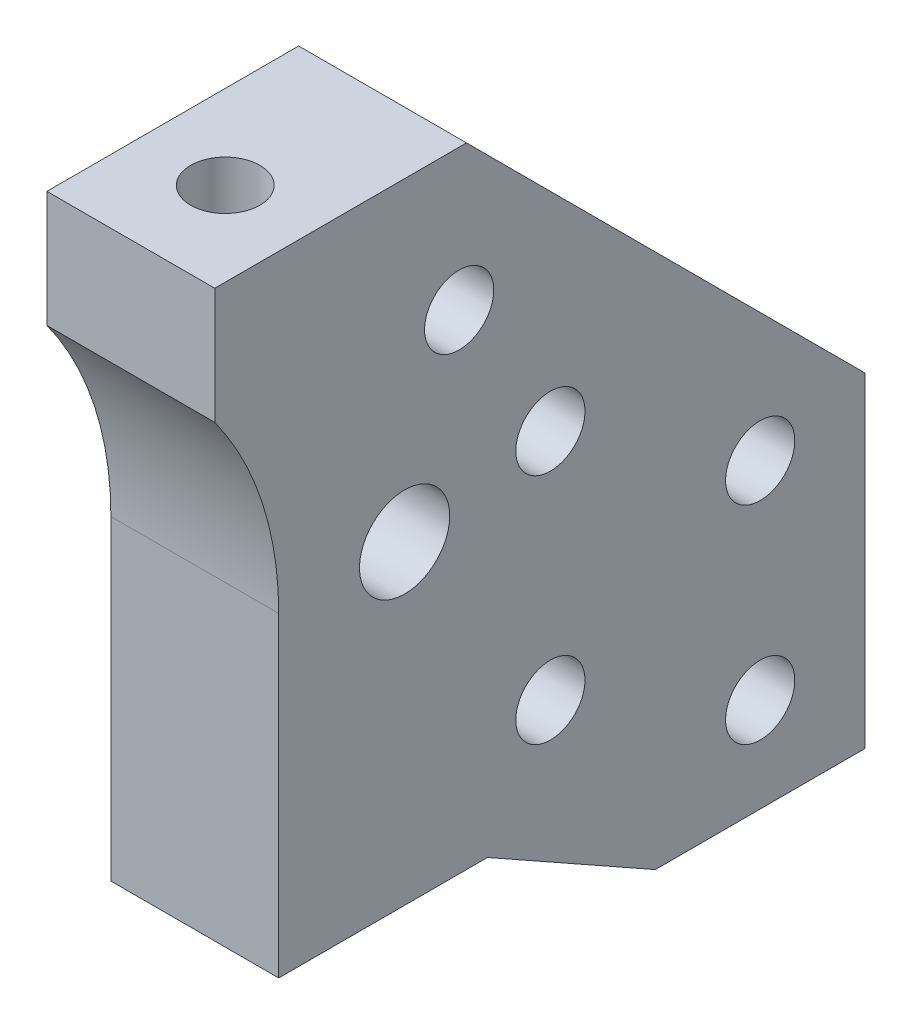
ISO-10303-21;
HEADER;
FILE_DESCRIPTION(('STEP AP214'),'2;1');
FILE_NAME('part.step','',(''),(''),'','','');
FILE_SCHEMA(('AUTOMOTIVE_DESIGN { 1 0 10303 214 1 1 1 1 }'));
ENDSEC;
DATA;
#1=APPLICATION_CONTEXT('core data for automotive mechanical design processes');
#2=APPLICATION_PROTOCOL_DEFINITION('international standard','automotive_design',2000,#1);
#3=PRODUCT_CONTEXT('',#1,'mechanical');
#4=PRODUCT('Part','Part','',(#3));
#5=PRODUCT_RELATED_PRODUCT_CATEGORY('part','',(#4));
#6=PRODUCT_DEFINITION_FORMATION('','',#4);
#7=PRODUCT_DEFINITION_CONTEXT('part definition',#1,'design');
#8=PRODUCT_DEFINITION('design','',#6,#7);
#9=PRODUCT_DEFINITION_SHAPE('','',#8);
#10=(LENGTH_UNIT() NAMED_UNIT(*) SI_UNIT(.MILLI.,.METRE.));
#11=(NAMED_UNIT(*) PLANE_ANGLE_UNIT() SI_UNIT($,.RADIAN.));
#12=(NAMED_UNIT(*) SI_UNIT($,.STERADIAN.) SOLID_ANGLE_UNIT());
#13=UNCERTAINTY_MEASURE_WITH_UNIT(LENGTH_MEASURE(1.E-05),#10,'distance_accuracy_value','');
#14=(GEOMETRIC_REPRESENTATION_CONTEXT(3) GLOBAL_UNCERTAINTY_ASSIGNED_CONTEXT((#13)) GLOBAL_UNIT_ASSIGNED_CONTEXT((#10,
#11,#12)) REPRESENTATION_CONTEXT('',''));
#15=CARTESIAN_POINT('',(0.,0.,0.));
#16=DIRECTION('',(0.,0.,1.));
#17=DIRECTION('',(1.,0.,0.));
#18=AXIS2_PLACEMENT_3D('',#15,#16,#17);
#19=CARTESIAN_POINT('',(-31.525,21.05,28.));
#20=DIRECTION('',(1.,0.,0.));
#21=DIRECTION('',(0.,0.,-1.));
#22=AXIS2_PLACEMENT_3D('',#19,#20,#21);
#23=CYLINDRICAL_SURFACE('',#22,16.05);
#24=CARTESIAN_POINT('',(-23.525,21.05,28.));
#25=DIRECTION('',(-1.,0.,0.));
#26=DIRECTION('',(0.,0.,1.));
#27=AXIS2_PLACEMENT_3D('',#24,#25,#26);
#28=CIRCLE('',#27,16.05);
#29=CARTESIAN_POINT('',(-23.525,30.462890098158,15.));
#30=VERTEX_POINT('',#29);
#31=CARTESIAN_POINT('',(-23.525,21.05,11.95));
#32=VERTEX_POINT('',#31);
#33=EDGE_CURVE('E158',#30,#32,#28,.T.);
#34=ORIENTED_EDGE('',*,*,#33,.F.);
#35=DIRECTION('',(1.,0.,0.));
#36=VECTOR('',#35,1.);
#37=CARTESIAN_POINT('',(-31.525,30.462890098158,15.));
#38=LINE('',#37,#36);
#39=CARTESIAN_POINT('',(-31.525,30.462890098158,15.));
#40=VERTEX_POINT('',#39);
#41=EDGE_CURVE('E11',#40,#30,#38,.T.);
#42=ORIENTED_EDGE('',*,*,#41,.F.);
#43=CARTESIAN_POINT('',(-31.525,21.05,28.));
#44=DIRECTION('',(-1.,0.,0.));
#45=DIRECTION('',(0.,0.,1.));
#46=AXIS2_PLACEMENT_3D('',#43,#44,#45);
#47=CIRCLE('',#46,16.05);
#48=CARTESIAN_POINT('',(-31.525,21.05,11.95));
#49=VERTEX_POINT('',#48);
#50=EDGE_CURVE('E182',#40,#49,#47,.T.);
#51=ORIENTED_EDGE('',*,*,#50,.T.);
#52=DIRECTION('',(1.,0.,0.));
#53=VECTOR('',#52,1.);
#54=CARTESIAN_POINT('',(-31.525,21.05,11.95));
#55=LINE('',#54,#53);
#56=EDGE_CURVE('E111',#49,#32,#55,.T.);
#57=ORIENTED_EDGE('',*,*,#56,.T.);
#58=EDGE_LOOP('',(#34,#42,#51,#57));
#59=FACE_BOUND('',#58,.T.);
#60=ADVANCED_FACE('F51',(#59),#23,.F.);
#61=CARTESIAN_POINT('',(-31.525,36.,15.));
#62=DIRECTION('',(0.,0.,1.));
#63=DIRECTION('',(0.,-1.,0.));
#64=AXIS2_PLACEMENT_3D('',#61,#62,#63);
#65=PLANE('',#64);
#66=DIRECTION('',(0.,-1.,0.));
#67=VECTOR('',#66,1.);
#68=CARTESIAN_POINT('',(-23.525,36.,15.));
#69=LINE('',#68,#67);
#70=CARTESIAN_POINT('',(-23.525,36.,15.));
#71=VERTEX_POINT('',#70);
#72=EDGE_CURVE('E180',#71,#30,#69,.T.);
#73=ORIENTED_EDGE('',*,*,#72,.F.);
#74=DIRECTION('',(1.,0.,0.));
#75=VECTOR('',#74,1.);
#76=CARTESIAN_POINT('',(-31.525,36.,15.));
#77=LINE('',#76,#75);
#78=CARTESIAN_POINT('',(-31.525,36.,15.));
#79=VERTEX_POINT('',#78);
#80=EDGE_CURVE('E60',#79,#71,#77,.T.);
#81=ORIENTED_EDGE('',*,*,#80,.F.);
#82=DIRECTION('',(0.,-1.,0.));
#83=VECTOR('',#82,1.);
#84=CARTESIAN_POINT('',(-31.525,36.,15.));
#85=LINE('',#84,#83);
#86=EDGE_CURVE('E148',#79,#40,#85,.T.);
#87=ORIENTED_EDGE('',*,*,#86,.T.);
#88=ORIENTED_EDGE('',*,*,#41,.T.);
#89=EDGE_LOOP('',(#73,#81,#87,#88));
#90=FACE_BOUND('',#89,.T.);
#91=ADVANCED_FACE('F256',(#90),#65,.T.);
#92=CARTESIAN_POINT('',(-31.525,36.,3.00000000000001));
#93=DIRECTION('',(0.,1.,0.));
#94=DIRECTION('',(0.,0.,1.));
#95=AXIS2_PLACEMENT_3D('',#92,#93,#94);
#96=PLANE('',#95);
#97=CARTESIAN_POINT('',(-27.525,36.,10.5));
#98=DIRECTION('',(0.,1.,0.));
#99=DIRECTION('',(0.,0.,1.));
#100=AXIS2_PLACEMENT_3D('',#97,#98,#99);
#101=CIRCLE('',#100,1.64999999999999);
#102=CARTESIAN_POINT('',(-27.525,36.,12.15));
#103=VERTEX_POINT('',#102);
#104=EDGE_CURVE('E345',#103,#103,#101,.T.);
#105=ORIENTED_EDGE('',*,*,#104,.F.);
#106=EDGE_LOOP('',(#105));
#107=FACE_BOUND('',#106,.T.);
#108=DIRECTION('',(0.,0.,1.));
#109=VECTOR('',#108,1.);
#110=CARTESIAN_POINT('',(-23.525,36.,3.00000000000001));
#111=LINE('',#110,#109);
#112=CARTESIAN_POINT('',(-23.525,36.,3.00000000000001));
#113=VERTEX_POINT('',#112);
#114=EDGE_CURVE('E135',#113,#71,#111,.T.);
#115=ORIENTED_EDGE('',*,*,#114,.F.);
#116=DIRECTION('',(1.,0.,0.));
#117=VECTOR('',#116,1.);
#118=CARTESIAN_POINT('',(-31.525,36.,3.00000000000001));
#119=LINE('',#118,#117);
#120=CARTESIAN_POINT('',(-31.525,36.,3.00000000000001));
#121=VERTEX_POINT('',#120);
#122=EDGE_CURVE('E130',#121,#113,#119,.T.);
#123=ORIENTED_EDGE('',*,*,#122,.F.);
#124=DIRECTION('',(0.,0.,1.));
#125=VECTOR('',#124,1.);
#126=CARTESIAN_POINT('',(-31.525,36.,3.00000000000001));
#127=LINE('',#126,#125);
#128=EDGE_CURVE('E133',#121,#79,#127,.T.);
#129=ORIENTED_EDGE('',*,*,#128,.T.);
#130=ORIENTED_EDGE('',*,*,#80,.T.);
#131=EDGE_LOOP('',(#115,#123,#129,#130));
#132=FACE_BOUND('',#131,.T.);
#133=ADVANCED_FACE('F132',(#107,#132),#96,.T.);
#134=CARTESIAN_POINT('',(-31.525,17.,-16.));
#135=DIRECTION('',(0.,0.707106781186549,-0.707106781186546));
#136=DIRECTION('',(0.,0.707106781186546,0.707106781186549));
#137=AXIS2_PLACEMENT_3D('',#134,#135,#136);
#138=PLANE('',#137);
#139=DIRECTION('',(0.,0.707106781186546,0.707106781186549));
#140=VECTOR('',#139,1.);
#141=CARTESIAN_POINT('',(-23.525,17.,-16.));
#142=LINE('',#141,#140);
#143=CARTESIAN_POINT('',(-23.525,17.,-16.));
#144=VERTEX_POINT('',#143);
#145=EDGE_CURVE('E177',#144,#113,#142,.T.);
#146=ORIENTED_EDGE('',*,*,#145,.F.);
#147=DIRECTION('',(1.,0.,0.));
#148=VECTOR('',#147,1.);
#149=CARTESIAN_POINT('',(-31.525,17.,-16.));
#150=LINE('',#149,#148);
#151=CARTESIAN_POINT('',(-31.525,17.,-16.));
#152=VERTEX_POINT('',#151);
#153=EDGE_CURVE('E140',#152,#144,#150,.T.);
#154=ORIENTED_EDGE('',*,*,#153,.F.);
#155=DIRECTION('',(0.,0.707106781186546,0.707106781186549));
#156=VECTOR('',#155,1.);
#157=CARTESIAN_POINT('',(-31.525,17.,-16.));
#158=LINE('',#157,#156);
#159=EDGE_CURVE('E146',#152,#121,#158,.T.);
#160=ORIENTED_EDGE('',*,*,#159,.T.);
#161=ORIENTED_EDGE('',*,*,#122,.T.);
#162=EDGE_LOOP('',(#146,#154,#160,#161));
#163=FACE_BOUND('',#162,.T.);
#164=ADVANCED_FACE('F150',(#163),#138,.T.);
#165=CARTESIAN_POINT('',(-31.525,1.5,-16.));
#166=DIRECTION('',(0.,0.,-1.));
#167=DIRECTION('',(-1.,0.,0.));
#168=AXIS2_PLACEMENT_3D('',#165,#166,#167);
#169=PLANE('',#168);
#170=DIRECTION('',(0.,1.,0.));
#171=VECTOR('',#170,1.);
#172=CARTESIAN_POINT('',(-23.525,1.5,-16.));
#173=LINE('',#172,#171);
#174=CARTESIAN_POINT('',(-23.525,1.5,-16.));
#175=VERTEX_POINT('',#174);
#176=EDGE_CURVE('E174',#175,#144,#173,.T.);
#177=ORIENTED_EDGE('',*,*,#176,.F.);
#178=DIRECTION('',(1.,0.,0.));
#179=VECTOR('',#178,1.);
#180=CARTESIAN_POINT('',(-31.525,1.5,-16.));
#181=LINE('',#180,#179);
#182=CARTESIAN_POINT('',(-31.525,1.5,-16.));
#183=VERTEX_POINT('',#182);
#184=EDGE_CURVE('E186',#183,#175,#181,.T.);
#185=ORIENTED_EDGE('',*,*,#184,.F.);
#186=DIRECTION('',(0.,1.,0.));
#187=VECTOR('',#186,1.);
#188=CARTESIAN_POINT('',(-31.525,1.5,-16.));
#189=LINE('',#188,#187);
#190=EDGE_CURVE('E151',#183,#152,#189,.T.);
#191=ORIENTED_EDGE('',*,*,#190,.T.);
#192=ORIENTED_EDGE('',*,*,#153,.T.);
#193=EDGE_LOOP('',(#177,#185,#191,#192));
#194=FACE_BOUND('',#193,.T.);
#195=ADVANCED_FACE('F272',(#194),#169,.T.);
#196=CARTESIAN_POINT('',(-31.525,1.5,-6.00000000000002));
#197=DIRECTION('',(0.,-1.,0.));
#198=DIRECTION('',(0.,0.,-1.));
#199=AXIS2_PLACEMENT_3D('',#196,#197,#198);
#200=PLANE('',#199);
#201=DIRECTION('',(0.,0.,-1.));
#202=VECTOR('',#201,1.);
#203=CARTESIAN_POINT('',(-23.525,1.5,-6.00000000000002));
#204=LINE('',#203,#202);
#205=CARTESIAN_POINT('',(-23.525,1.5,-6.00000000000002));
#206=VERTEX_POINT('',#205);
#207=EDGE_CURVE('E171',#206,#175,#204,.T.);
#208=ORIENTED_EDGE('',*,*,#207,.F.);
#209=DIRECTION('',(1.,0.,0.));
#210=VECTOR('',#209,1.);
#211=CARTESIAN_POINT('',(-31.525,1.5,-6.00000000000002));
#212=LINE('',#211,#210);
#213=CARTESIAN_POINT('',(-31.525,1.5,-6.00000000000002));
#214=VERTEX_POINT('',#213);
#215=EDGE_CURVE('E188',#214,#206,#212,.T.);
#216=ORIENTED_EDGE('',*,*,#215,.F.);
#217=DIRECTION('',(0.,0.,-1.));
#218=VECTOR('',#217,1.);
#219=CARTESIAN_POINT('',(-31.525,1.5,-6.00000000000002));
#220=LINE('',#219,#218);
#221=EDGE_CURVE('E153',#214,#183,#220,.T.);
#222=ORIENTED_EDGE('',*,*,#221,.T.);
#223=ORIENTED_EDGE('',*,*,#184,.T.);
#224=EDGE_LOOP('',(#208,#216,#222,#223));
#225=FACE_BOUND('',#224,.T.);
#226=ADVANCED_FACE('F243',(#225),#200,.T.);
#227=CARTESIAN_POINT('',(-31.525,5.99999999999999,1.99999999999998));
#228=DIRECTION('',(0.,-0.87157553712455,0.490261239632558));
#229=DIRECTION('',(0.,-0.490261239632558,-0.87157553712455));
#230=AXIS2_PLACEMENT_3D('',#227,#228,#229);
#231=PLANE('',#230);
#232=DIRECTION('',(0.,-0.490261239632558,-0.87157553712455));
#233=VECTOR('',#232,1.);
#234=CARTESIAN_POINT('',(-23.525,5.99999999999999,1.99999999999998));
#235=LINE('',#234,#233);
#236=CARTESIAN_POINT('',(-23.525,5.99999999999999,1.99999999999998));
#237=VERTEX_POINT('',#236);
#238=EDGE_CURVE('E168',#237,#206,#235,.T.);
#239=ORIENTED_EDGE('',*,*,#238,.F.);
#240=DIRECTION('',(1.,0.,0.));
#241=VECTOR('',#240,1.);
#242=CARTESIAN_POINT('',(-31.525,5.99999999999999,1.99999999999998));
#243=LINE('',#242,#241);
#244=CARTESIAN_POINT('',(-31.525,5.99999999999999,1.99999999999998));
#245=VERTEX_POINT('',#244);
#246=EDGE_CURVE('E190',#245,#237,#243,.T.);
#247=ORIENTED_EDGE('',*,*,#246,.F.);
#248=DIRECTION('',(0.,-0.490261239632558,-0.87157553712455));
#249=VECTOR('',#248,1.);
#250=CARTESIAN_POINT('',(-31.525,5.99999999999999,1.99999999999998));
#251=LINE('',#250,#249);
#252=EDGE_CURVE('E237',#245,#214,#251,.T.);
#253=ORIENTED_EDGE('',*,*,#252,.T.);
#254=ORIENTED_EDGE('',*,*,#215,.T.);
#255=EDGE_LOOP('',(#239,#247,#253,#254));
#256=FACE_BOUND('',#255,.T.);
#257=ADVANCED_FACE('F249',(#256),#231,.T.);
#258=CARTESIAN_POINT('',(-31.525,5.99999999999999,11.95));
#259=DIRECTION('',(0.,-1.,0.));
#260=DIRECTION('',(0.,0.,-1.));
#261=AXIS2_PLACEMENT_3D('',#258,#259,#260);
#262=PLANE('',#261);
#263=CARTESIAN_POINT('',(-27.525,5.99999999999999,6.98749999999999));
#264=DIRECTION('',(0.,-1.,0.));
#265=DIRECTION('',(0.,0.,-1.));
#266=AXIS2_PLACEMENT_3D('',#263,#264,#265);
#267=CIRCLE('',#266,1.64999999999999);
#268=CARTESIAN_POINT('',(-27.525,5.99999999999999,5.3375));
#269=VERTEX_POINT('',#268);
#270=EDGE_CURVE('E347',#269,#269,#267,.T.);
#271=ORIENTED_EDGE('',*,*,#270,.F.);
#272=EDGE_LOOP('',(#271));
#273=FACE_BOUND('',#272,.T.);
#274=DIRECTION('',(0.,0.,-1.));
#275=VECTOR('',#274,1.);
#276=CARTESIAN_POINT('',(-23.525,5.99999999999999,11.95));
#277=LINE('',#276,#275);
#278=CARTESIAN_POINT('',(-23.525,5.99999999999999,11.95));
#279=VERTEX_POINT('',#278);
#280=EDGE_CURVE('E165',#279,#237,#277,.T.);
#281=ORIENTED_EDGE('',*,*,#280,.F.);
#282=DIRECTION('',(1.,0.,0.));
#283=VECTOR('',#282,1.);
#284=CARTESIAN_POINT('',(-31.525,5.99999999999999,11.95));
#285=LINE('',#284,#283);
#286=CARTESIAN_POINT('',(-31.525,5.99999999999999,11.95));
#287=VERTEX_POINT('',#286);
#288=EDGE_CURVE('E192',#287,#279,#285,.T.);
#289=ORIENTED_EDGE('',*,*,#288,.F.);
#290=DIRECTION('',(0.,0.,-1.));
#291=VECTOR('',#290,1.);
#292=CARTESIAN_POINT('',(-31.525,5.99999999999999,11.95));
#293=LINE('',#292,#291);
#294=EDGE_CURVE('E234',#287,#245,#293,.T.);
#295=ORIENTED_EDGE('',*,*,#294,.T.);
#296=ORIENTED_EDGE('',*,*,#246,.T.);
#297=EDGE_LOOP('',(#281,#289,#295,#296));
#298=FACE_BOUND('',#297,.T.);
#299=ADVANCED_FACE('F252',(#273,#298),#262,.T.);
#300=CARTESIAN_POINT('',(-31.525,5.99999999999999,11.95));
#301=DIRECTION('',(0.,0.,1.));
#302=DIRECTION('',(0.,-1.,0.));
#303=AXIS2_PLACEMENT_3D('',#300,#301,#302);
#304=PLANE('',#303);
#305=DIRECTION('',(0.,-1.,0.));
#306=VECTOR('',#305,1.);
#307=CARTESIAN_POINT('',(-23.525,5.99999999999999,11.95));
#308=LINE('',#307,#306);
#309=EDGE_CURVE('E161',#32,#279,#308,.T.);
#310=ORIENTED_EDGE('',*,*,#309,.F.);
#311=ORIENTED_EDGE('',*,*,#56,.F.);
#312=DIRECTION('',(0.,-1.,0.));
#313=VECTOR('',#312,1.);
#314=CARTESIAN_POINT('',(-31.525,5.99999999999999,11.95));
#315=LINE('',#314,#313);
#316=EDGE_CURVE('E232',#49,#287,#315,.T.);
#317=ORIENTED_EDGE('',*,*,#316,.T.);
#318=ORIENTED_EDGE('',*,*,#288,.T.);
#319=EDGE_LOOP('',(#310,#311,#317,#318));
#320=FACE_BOUND('',#319,.T.);
#321=ADVANCED_FACE('F253',(#320),#304,.T.);
#322=CARTESIAN_POINT('',(-31.525,21.05,28.));
#323=DIRECTION('',(-1.,0.,0.));
#324=DIRECTION('',(0.,0.,1.));
#325=AXIS2_PLACEMENT_3D('',#322,#323,#324);
#326=PLANE('',#325);
#327=CARTESIAN_POINT('',(-31.525,29.2789321881345,3.34999999999999));
#328=DIRECTION('',(-1.,0.,0.));
#329=DIRECTION('',(0.,0.,1.));
#330=AXIS2_PLACEMENT_3D('',#327,#328,#329);
#331=CIRCLE('',#330,1.64999999999999);
#332=CARTESIAN_POINT('',(-31.525,29.2789321881345,4.99999999999998));
#333=VERTEX_POINT('',#332);
#334=EDGE_CURVE('E215',#333,#333,#331,.T.);
#335=ORIENTED_EDGE('',*,*,#334,.F.);
#336=EDGE_LOOP('',(#335));
#337=FACE_BOUND('',#336,.T.);
#338=CARTESIAN_POINT('',(-31.525,11.,-1.00000000000001));
#339=DIRECTION('',(-1.,0.,0.));
#340=DIRECTION('',(0.,0.,1.));
#341=AXIS2_PLACEMENT_3D('',#338,#339,#340);
#342=CIRCLE('',#341,1.64999999999999);
#343=CARTESIAN_POINT('',(-31.525,11.,0.649999999999973));
#344=VERTEX_POINT('',#343);
#345=EDGE_CURVE('E205',#344,#344,#342,.T.);
#346=ORIENTED_EDGE('',*,*,#345,.F.);
#347=EDGE_LOOP('',(#346));
#348=FACE_BOUND('',#347,.T.);
#349=CARTESIAN_POINT('',(-31.525,22.1005050633883,-1.00000000000001));
#350=DIRECTION('',(-1.,0.,0.));
#351=DIRECTION('',(0.,0.,1.));
#352=AXIS2_PLACEMENT_3D('',#349,#350,#351);
#353=CIRCLE('',#352,1.64999999999999);
#354=CARTESIAN_POINT('',(-31.525,22.1005050633883,0.649999999999975));
#355=VERTEX_POINT('',#354);
#356=EDGE_CURVE('E202',#355,#355,#353,.T.);
#357=ORIENTED_EDGE('',*,*,#356,.F.);
#358=EDGE_LOOP('',(#357));
#359=FACE_BOUND('',#358,.T.);
#360=CARTESIAN_POINT('',(-31.525,15.8859414427245,-11.));
#361=DIRECTION('',(-1.,0.,0.));
#362=DIRECTION('',(0.,0.,1.));
#363=AXIS2_PLACEMENT_3D('',#360,#361,#362);
#364=CIRCLE('',#363,1.64999999999999);
#365=CARTESIAN_POINT('',(-31.525,15.8859414427245,-9.35000000000003));
#366=VERTEX_POINT('',#365);
#367=EDGE_CURVE('E199',#366,#366,#364,.T.);
#368=ORIENTED_EDGE('',*,*,#367,.F.);
#369=EDGE_LOOP('',(#368));
#370=FACE_BOUND('',#369,.T.);
#371=CARTESIAN_POINT('',(-31.525,6.,-11.));
#372=DIRECTION('',(-1.,0.,0.));
#373=DIRECTION('',(0.,0.,1.));
#374=AXIS2_PLACEMENT_3D('',#371,#372,#373);
#375=CIRCLE('',#374,1.64999999999999);
#376=CARTESIAN_POINT('',(-31.525,6.,-9.35000000000003));
#377=VERTEX_POINT('',#376);
#378=EDGE_CURVE('E198',#377,#377,#375,.T.);
#379=ORIENTED_EDGE('',*,*,#378,.F.);
#380=EDGE_LOOP('',(#379));
#381=FACE_BOUND('',#380,.T.);
#382=CARTESIAN_POINT('',(-31.525,21.,5.94999999999998));
#383=DIRECTION('',(1.,0.,0.));
#384=DIRECTION('',(0.,0.,-1.));
#385=AXIS2_PLACEMENT_3D('',#382,#383,#384);
#386=CIRCLE('',#385,2.15);
#387=CARTESIAN_POINT('',(-31.525,21.,3.79999999999999));
#388=VERTEX_POINT('',#387);
#389=EDGE_CURVE('E162',#388,#388,#386,.T.);
#390=ORIENTED_EDGE('',*,*,#389,.T.);
#391=EDGE_LOOP('',(#390));
#392=FACE_BOUND('',#391,.T.);
#393=ORIENTED_EDGE('',*,*,#50,.F.);
#394=ORIENTED_EDGE('',*,*,#86,.F.);
#395=ORIENTED_EDGE('',*,*,#128,.F.);
#396=ORIENTED_EDGE('',*,*,#159,.F.);
#397=ORIENTED_EDGE('',*,*,#190,.F.);
#398=ORIENTED_EDGE('',*,*,#221,.F.);
#399=ORIENTED_EDGE('',*,*,#252,.F.);
#400=ORIENTED_EDGE('',*,*,#294,.F.);
#401=ORIENTED_EDGE('',*,*,#316,.F.);
#402=EDGE_LOOP('',(#393,#394,#395,#396,#397,#398,#399,#400,#401));
#403=FACE_BOUND('',#402,.T.);
#404=ADVANCED_FACE('F144',(#337,#348,#359,#370,#381,#392,#403),#326,.T.);
#405=CARTESIAN_POINT('',(-23.525,21.05,28.));
#406=DIRECTION('',(-1.,0.,0.));
#407=DIRECTION('',(0.,0.,1.));
#408=AXIS2_PLACEMENT_3D('',#405,#406,#407);
#409=PLANE('',#408);
#410=CARTESIAN_POINT('',(-23.525,29.2789321881345,3.34999999999999));
#411=DIRECTION('',(-1.,0.,0.));
#412=DIRECTION('',(0.,0.,1.));
#413=AXIS2_PLACEMENT_3D('',#410,#411,#412);
#414=CIRCLE('',#413,1.64999999999999);
#415=CARTESIAN_POINT('',(-23.525,29.2789321881345,4.99999999999998));
#416=VERTEX_POINT('',#415);
#417=EDGE_CURVE('E54',#416,#416,#414,.T.);
#418=ORIENTED_EDGE('',*,*,#417,.T.);
#419=EDGE_LOOP('',(#418));
#420=FACE_BOUND('',#419,.T.);
#421=CARTESIAN_POINT('',(-23.525,11.,-1.00000000000001));
#422=DIRECTION('',(-1.,0.,0.));
#423=DIRECTION('',(0.,0.,1.));
#424=AXIS2_PLACEMENT_3D('',#421,#422,#423);
#425=CIRCLE('',#424,1.64999999999999);
#426=CARTESIAN_POINT('',(-23.525,11.,0.649999999999975));
#427=VERTEX_POINT('',#426);
#428=EDGE_CURVE('E203',#427,#427,#425,.T.);
#429=ORIENTED_EDGE('',*,*,#428,.T.);
#430=EDGE_LOOP('',(#429));
#431=FACE_BOUND('',#430,.T.);
#432=CARTESIAN_POINT('',(-23.525,22.1005050633883,-1.00000000000001));
#433=DIRECTION('',(-1.,0.,0.));
#434=DIRECTION('',(0.,0.,1.));
#435=AXIS2_PLACEMENT_3D('',#432,#433,#434);
#436=CIRCLE('',#435,1.64999999999999);
#437=CARTESIAN_POINT('',(-23.525,22.1005050633883,0.649999999999977));
#438=VERTEX_POINT('',#437);
#439=EDGE_CURVE('E200',#438,#438,#436,.T.);
#440=ORIENTED_EDGE('',*,*,#439,.T.);
#441=EDGE_LOOP('',(#440));
#442=FACE_BOUND('',#441,.T.);
#443=CARTESIAN_POINT('',(-23.525,15.8859414427245,-11.));
#444=DIRECTION('',(-1.,0.,0.));
#445=DIRECTION('',(0.,0.,1.));
#446=AXIS2_PLACEMENT_3D('',#443,#444,#445);
#447=CIRCLE('',#446,1.64999999999999);
#448=CARTESIAN_POINT('',(-23.525,15.8859414427245,-9.35000000000003));
#449=VERTEX_POINT('',#448);
#450=EDGE_CURVE('E195',#449,#449,#447,.T.);
#451=ORIENTED_EDGE('',*,*,#450,.T.);
#452=EDGE_LOOP('',(#451));
#453=FACE_BOUND('',#452,.T.);
#454=CARTESIAN_POINT('',(-23.525,6.,-11.));
#455=DIRECTION('',(-1.,0.,0.));
#456=DIRECTION('',(0.,0.,1.));
#457=AXIS2_PLACEMENT_3D('',#454,#455,#456);
#458=CIRCLE('',#457,1.64999999999999);
#459=CARTESIAN_POINT('',(-23.525,6.,-9.35000000000003));
#460=VERTEX_POINT('',#459);
#461=EDGE_CURVE('E223',#460,#460,#458,.T.);
#462=ORIENTED_EDGE('',*,*,#461,.T.);
#463=EDGE_LOOP('',(#462));
#464=FACE_BOUND('',#463,.T.);
#465=CARTESIAN_POINT('',(-23.525,21.,5.94999999999998));
#466=DIRECTION('',(1.,0.,0.));
#467=DIRECTION('',(0.,0.,-1.));
#468=AXIS2_PLACEMENT_3D('',#465,#466,#467);
#469=CIRCLE('',#468,2.15);
#470=CARTESIAN_POINT('',(-23.525,21.,3.79999999999999));
#471=VERTEX_POINT('',#470);
#472=EDGE_CURVE('E226',#471,#471,#469,.T.);
#473=ORIENTED_EDGE('',*,*,#472,.F.);
#474=EDGE_LOOP('',(#473));
#475=FACE_BOUND('',#474,.T.);
#476=ORIENTED_EDGE('',*,*,#33,.T.);
#477=ORIENTED_EDGE('',*,*,#309,.T.);
#478=ORIENTED_EDGE('',*,*,#280,.T.);
#479=ORIENTED_EDGE('',*,*,#238,.T.);
#480=ORIENTED_EDGE('',*,*,#207,.T.);
#481=ORIENTED_EDGE('',*,*,#176,.T.);
#482=ORIENTED_EDGE('',*,*,#145,.T.);
#483=ORIENTED_EDGE('',*,*,#114,.T.);
#484=ORIENTED_EDGE('',*,*,#72,.T.);
#485=EDGE_LOOP('',(#476,#477,#478,#479,#480,#481,#482,#483,#484));
#486=FACE_BOUND('',#485,.T.);
#487=ADVANCED_FACE('F255',(#420,#431,#442,#453,#464,#475,#486),#409,.F.);
#488=CARTESIAN_POINT('',(-31.525,21.,5.94999999999998));
#489=DIRECTION('',(1.,0.,0.));
#490=DIRECTION('',(0.,0.,-1.));
#491=AXIS2_PLACEMENT_3D('',#488,#489,#490);
#492=CYLINDRICAL_SURFACE('',#491,2.15);
#493=ORIENTED_EDGE('',*,*,#389,.F.);
#494=EDGE_LOOP('',(#493));
#495=FACE_BOUND('',#494,.T.);
#496=ORIENTED_EDGE('',*,*,#472,.T.);
#497=EDGE_LOOP('',(#496));
#498=FACE_BOUND('',#497,.T.);
#499=ADVANCED_FACE('F295',(#495,#498),#492,.F.);
#500=CARTESIAN_POINT('',(-31.525,6.,-11.));
#501=DIRECTION('',(-1.,0.,0.));
#502=DIRECTION('',(0.,0.,1.));
#503=AXIS2_PLACEMENT_3D('',#500,#501,#502);
#504=CYLINDRICAL_SURFACE('',#503,1.64999999999999);
#505=ORIENTED_EDGE('',*,*,#378,.T.);
#506=EDGE_LOOP('',(#505));
#507=FACE_BOUND('',#506,.T.);
#508=ORIENTED_EDGE('',*,*,#461,.F.);
#509=EDGE_LOOP('',(#508));
#510=FACE_BOUND('',#509,.T.);
#511=ADVANCED_FACE('F302',(#507,#510),#504,.F.);
#512=CARTESIAN_POINT('',(-31.525,15.8859414427245,-11.));
#513=DIRECTION('',(-1.,0.,0.));
#514=DIRECTION('',(0.,0.,1.));
#515=AXIS2_PLACEMENT_3D('',#512,#513,#514);
#516=CYLINDRICAL_SURFACE('',#515,1.64999999999999);
#517=ORIENTED_EDGE('',*,*,#367,.T.);
#518=EDGE_LOOP('',(#517));
#519=FACE_BOUND('',#518,.T.);
#520=ORIENTED_EDGE('',*,*,#450,.F.);
#521=EDGE_LOOP('',(#520));
#522=FACE_BOUND('',#521,.T.);
#523=ADVANCED_FACE('F306',(#519,#522),#516,.F.);
#524=CARTESIAN_POINT('',(-31.525,22.1005050633883,-1.00000000000001));
#525=DIRECTION('',(-1.,0.,0.));
#526=DIRECTION('',(0.,0.,1.));
#527=AXIS2_PLACEMENT_3D('',#524,#525,#526);
#528=CYLINDRICAL_SURFACE('',#527,1.64999999999999);
#529=ORIENTED_EDGE('',*,*,#356,.T.);
#530=EDGE_LOOP('',(#529));
#531=FACE_BOUND('',#530,.T.);
#532=ORIENTED_EDGE('',*,*,#439,.F.);
#533=EDGE_LOOP('',(#532));
#534=FACE_BOUND('',#533,.T.);
#535=ADVANCED_FACE('F310',(#531,#534),#528,.F.);
#536=CARTESIAN_POINT('',(-31.525,11.,-1.00000000000001));
#537=DIRECTION('',(-1.,0.,0.));
#538=DIRECTION('',(0.,0.,1.));
#539=AXIS2_PLACEMENT_3D('',#536,#537,#538);
#540=CYLINDRICAL_SURFACE('',#539,1.64999999999999);
#541=ORIENTED_EDGE('',*,*,#345,.T.);
#542=EDGE_LOOP('',(#541));
#543=FACE_BOUND('',#542,.T.);
#544=ORIENTED_EDGE('',*,*,#428,.F.);
#545=EDGE_LOOP('',(#544));
#546=FACE_BOUND('',#545,.T.);
#547=ADVANCED_FACE('F314',(#543,#546),#540,.F.);
#548=CARTESIAN_POINT('',(-31.525,29.2789321881345,3.34999999999999));
#549=DIRECTION('',(-1.,0.,0.));
#550=DIRECTION('',(0.,0.,1.));
#551=AXIS2_PLACEMENT_3D('',#548,#549,#550);
#552=CYLINDRICAL_SURFACE('',#551,1.64999999999999);
#553=ORIENTED_EDGE('',*,*,#334,.T.);
#554=EDGE_LOOP('',(#553));
#555=FACE_BOUND('',#554,.T.);
#556=ORIENTED_EDGE('',*,*,#417,.F.);
#557=EDGE_LOOP('',(#556));
#558=FACE_BOUND('',#557,.T.);
#559=ADVANCED_FACE('F318',(#555,#558),#552,.F.);
#560=CARTESIAN_POINT('',(-27.525,17.5,6.98749999999999));
#561=DIRECTION('',(0.,-1.,0.));
#562=DIRECTION('',(0.,0.,-1.));
#563=AXIS2_PLACEMENT_3D('',#560,#561,#562);
#564=CONICAL_SURFACE('',#563,1.65,1.02974425867665);
#565=CARTESIAN_POINT('',(-27.525,18.4914200213955,6.98749999999999));
#566=VERTEX_POINT('',#565);
#567=VERTEX_LOOP('',#566);
#568=FACE_BOUND('',#567,.T.);
#569=CARTESIAN_POINT('',(-27.525,17.5,6.98749999999999));
#570=DIRECTION('',(0.,-1.,0.));
#571=DIRECTION('',(0.,0.,-1.));
#572=AXIS2_PLACEMENT_3D('',#569,#570,#571);
#573=CIRCLE('',#572,1.65);
#574=CARTESIAN_POINT('',(-27.525,17.5,5.33749999999999));
#575=VERTEX_POINT('',#574);
#576=EDGE_CURVE('E351',#575,#575,#573,.T.);
#577=ORIENTED_EDGE('',*,*,#576,.T.);
#578=EDGE_LOOP('',(#577));
#579=FACE_BOUND('',#578,.T.);
#580=ADVANCED_FACE('F321',(#568,#579),#564,.F.);
#581=CARTESIAN_POINT('',(-27.525,5.99999999999999,6.98749999999999));
#582=DIRECTION('',(0.,-1.,0.));
#583=DIRECTION('',(0.,0.,-1.));
#584=AXIS2_PLACEMENT_3D('',#581,#582,#583);
#585=CYLINDRICAL_SURFACE('',#584,1.65);
#586=ORIENTED_EDGE('',*,*,#576,.F.);
#587=EDGE_LOOP('',(#586));
#588=FACE_BOUND('',#587,.T.);
#589=ORIENTED_EDGE('',*,*,#270,.T.);
#590=EDGE_LOOP('',(#589));
#591=FACE_BOUND('',#590,.T.);
#592=ADVANCED_FACE('F325',(#588,#591),#585,.F.);
#593=CARTESIAN_POINT('',(-27.525,24.5,10.5));
#594=DIRECTION('',(0.,1.,0.));
#595=DIRECTION('',(0.,0.,1.));
#596=AXIS2_PLACEMENT_3D('',#593,#594,#595);
#597=CONICAL_SURFACE('',#596,1.65,1.02974425867665);
#598=CARTESIAN_POINT('',(-27.525,23.5085799786045,10.5));
#599=VERTEX_POINT('',#598);
#600=VERTEX_LOOP('',#599);
#601=FACE_BOUND('',#600,.T.);
#602=CARTESIAN_POINT('',(-27.525,24.5,10.5));
#603=DIRECTION('',(0.,1.,0.));
#604=DIRECTION('',(0.,0.,1.));
#605=AXIS2_PLACEMENT_3D('',#602,#603,#604);
#606=CIRCLE('',#605,1.65);
#607=CARTESIAN_POINT('',(-27.525,24.5,12.15));
#608=VERTEX_POINT('',#607);
#609=EDGE_CURVE('E342',#608,#608,#606,.T.);
#610=ORIENTED_EDGE('',*,*,#609,.T.);
#611=EDGE_LOOP('',(#610));
#612=FACE_BOUND('',#611,.T.);
#613=ADVANCED_FACE('F329',(#601,#612),#597,.F.);
#614=CARTESIAN_POINT('',(-27.525,36.,10.5));
#615=DIRECTION('',(0.,1.,0.));
#616=DIRECTION('',(0.,0.,1.));
#617=AXIS2_PLACEMENT_3D('',#614,#615,#616);
#618=CYLINDRICAL_SURFACE('',#617,1.65);
#619=ORIENTED_EDGE('',*,*,#609,.F.);
#620=EDGE_LOOP('',(#619));
#621=FACE_BOUND('',#620,.T.);
#622=ORIENTED_EDGE('',*,*,#104,.T.);
#623=EDGE_LOOP('',(#622));
#624=FACE_BOUND('',#623,.T.);
#625=ADVANCED_FACE('F333',(#621,#624),#618,.F.);
#626=CLOSED_SHELL('',(#60,#91,#133,#164,#195,#226,#257,#299,#321,#404,#487,#499,#511,#523,#535,
#547,#559,#580,#592,#613,#625));
#627=MANIFOLD_SOLID_BREP('B2',#626);
#628=ADVANCED_BREP_SHAPE_REPRESENTATION('',(#18,#627),#14);
#629=SHAPE_DEFINITION_REPRESENTATION(#9,#628);
ENDSEC;
END-ISO-10303-21;
